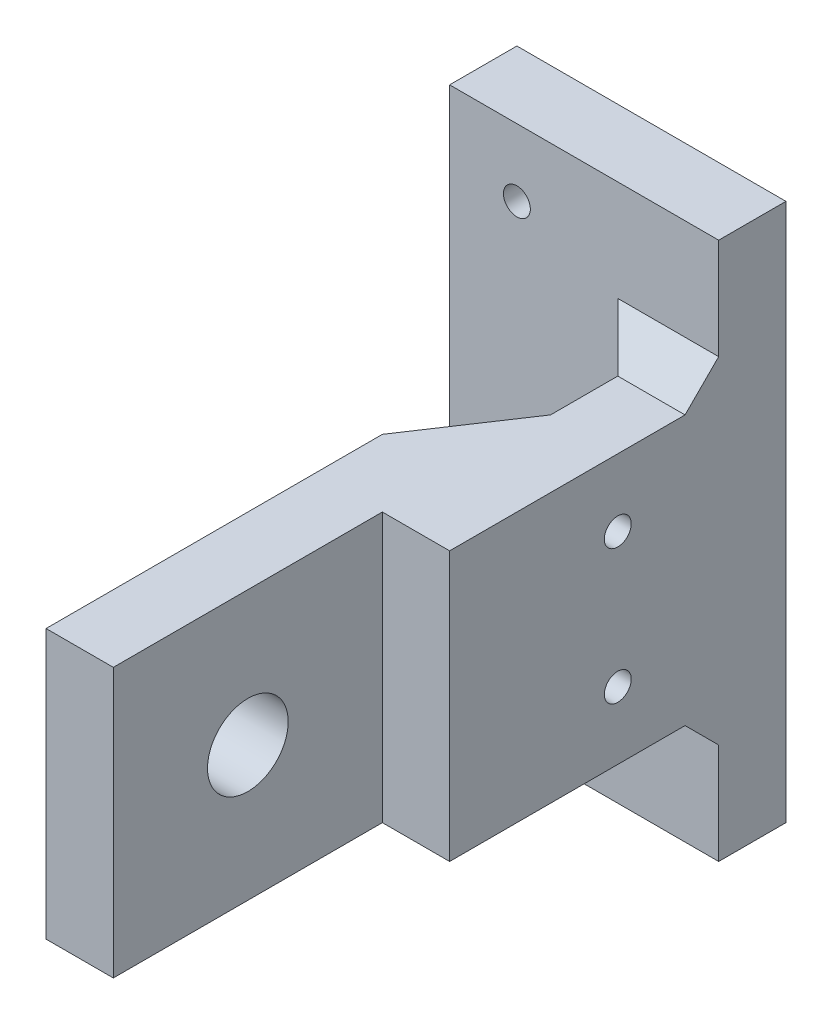
ISO-10303-21;
HEADER;
FILE_DESCRIPTION(('STEP AP214'),'2;1');
FILE_NAME('part.step','',(''),(''),'','','');
FILE_SCHEMA(('AUTOMOTIVE_DESIGN { 1 0 10303 214 1 1 1 1 }'));
ENDSEC;
DATA;
#1=APPLICATION_CONTEXT('core data for automotive mechanical design processes');
#2=APPLICATION_PROTOCOL_DEFINITION('international standard','automotive_design',2000,#1);
#3=PRODUCT_CONTEXT('',#1,'mechanical');
#4=PRODUCT('Part','Part','',(#3));
#5=PRODUCT_RELATED_PRODUCT_CATEGORY('part','',(#4));
#6=PRODUCT_DEFINITION_FORMATION('','',#4);
#7=PRODUCT_DEFINITION_CONTEXT('part definition',#1,'design');
#8=PRODUCT_DEFINITION('design','',#6,#7);
#9=PRODUCT_DEFINITION_SHAPE('','',#8);
#10=(LENGTH_UNIT() NAMED_UNIT(*) SI_UNIT(.MILLI.,.METRE.));
#11=(NAMED_UNIT(*) PLANE_ANGLE_UNIT() SI_UNIT($,.RADIAN.));
#12=(NAMED_UNIT(*) SI_UNIT($,.STERADIAN.) SOLID_ANGLE_UNIT());
#13=UNCERTAINTY_MEASURE_WITH_UNIT(LENGTH_MEASURE(1.E-05),#10,'distance_accuracy_value','');
#14=(GEOMETRIC_REPRESENTATION_CONTEXT(3) GLOBAL_UNCERTAINTY_ASSIGNED_CONTEXT((#13)) GLOBAL_UNIT_ASSIGNED_CONTEXT((#10,
#11,#12)) REPRESENTATION_CONTEXT('',''));
#15=CARTESIAN_POINT('',(0.,0.,0.));
#16=DIRECTION('',(0.,0.,1.));
#17=DIRECTION('',(1.,0.,0.));
#18=AXIS2_PLACEMENT_3D('',#15,#16,#17);
#19=CARTESIAN_POINT('',(-10.,40.001,40.));
#20=DIRECTION('',(1.,0.,0.));
#21=DIRECTION('',(0.,0.,-1.));
#22=AXIS2_PLACEMENT_3D('',#19,#20,#21);
#23=PLANE('',#22);
#24=CARTESIAN_POINT('',(-10.,-10.,25.));
#25=DIRECTION('',(-1.,0.,0.));
#26=DIRECTION('',(0.,0.,1.));
#27=AXIS2_PLACEMENT_3D('',#24,#25,#26);
#28=CIRCLE('',#27,2.);
#29=CARTESIAN_POINT('',(-10.,-10.,27.));
#30=VERTEX_POINT('',#29);
#31=EDGE_CURVE('E592',#30,#30,#28,.T.);
#32=ORIENTED_EDGE('',*,*,#31,.F.);
#33=EDGE_LOOP('',(#32));
#34=FACE_BOUND('',#33,.T.);
#35=CARTESIAN_POINT('',(-10.,10.,25.));
#36=DIRECTION('',(-1.,0.,0.));
#37=DIRECTION('',(0.,0.,1.));
#38=AXIS2_PLACEMENT_3D('',#35,#36,#37);
#39=CIRCLE('',#38,2.);
#40=CARTESIAN_POINT('',(-10.,10.,27.));
#41=VERTEX_POINT('',#40);
#42=EDGE_CURVE('E213',#41,#41,#39,.T.);
#43=ORIENTED_EDGE('',*,*,#42,.F.);
#44=EDGE_LOOP('',(#43));
#45=FACE_BOUND('',#44,.T.);
#46=DIRECTION('',(0.,0.,-1.));
#47=VECTOR('',#46,1.);
#48=CARTESIAN_POINT('',(-10.,20.,40.));
#49=LINE('',#48,#47);
#50=CARTESIAN_POINT('',(-10.,20.,25.));
#51=VERTEX_POINT('',#50);
#52=CARTESIAN_POINT('',(-10.,20.,15.));
#53=VERTEX_POINT('',#52);
#54=EDGE_CURVE('E180',#51,#53,#49,.T.);
#55=ORIENTED_EDGE('',*,*,#54,.T.);
#56=DIRECTION('',(0.,-1.,0.));
#57=VECTOR('',#56,1.);
#58=CARTESIAN_POINT('',(-10.,40.001,15.));
#59=LINE('',#58,#57);
#60=CARTESIAN_POINT('',(-10.,-20.,15.));
#61=VERTEX_POINT('',#60);
#62=EDGE_CURVE('E83',#53,#61,#59,.T.);
#63=ORIENTED_EDGE('',*,*,#62,.T.);
#64=DIRECTION('',(0.,0.,1.));
#65=VECTOR('',#64,1.);
#66=CARTESIAN_POINT('',(-10.,-20.,40.));
#67=LINE('',#66,#65);
#68=CARTESIAN_POINT('',(-10.,-20.,25.));
#69=VERTEX_POINT('',#68);
#70=EDGE_CURVE('E190',#61,#69,#67,.T.);
#71=ORIENTED_EDGE('',*,*,#70,.T.);
#72=DIRECTION('',(0.,-1.,0.));
#73=VECTOR('',#72,1.);
#74=CARTESIAN_POINT('',(-10.,-17.,25.));
#75=LINE('',#74,#73);
#76=CARTESIAN_POINT('',(-10.,-17.,25.));
#77=VERTEX_POINT('',#76);
#78=EDGE_CURVE('E191',#77,#69,#75,.T.);
#79=ORIENTED_EDGE('',*,*,#78,.F.);
#80=DIRECTION('',(0.,0.,1.));
#81=VECTOR('',#80,1.);
#82=CARTESIAN_POINT('',(-10.,-17.,25.));
#83=LINE('',#82,#81);
#84=CARTESIAN_POINT('',(-10.,-17.,40.));
#85=VERTEX_POINT('',#84);
#86=EDGE_CURVE('E224',#77,#85,#83,.T.);
#87=ORIENTED_EDGE('',*,*,#86,.T.);
#88=DIRECTION('',(0.,-1.,0.));
#89=VECTOR('',#88,1.);
#90=CARTESIAN_POINT('',(-10.,40.001,40.));
#91=LINE('',#90,#89);
#92=CARTESIAN_POINT('',(-10.,17.,40.));
#93=VERTEX_POINT('',#92);
#94=EDGE_CURVE('E234',#93,#85,#91,.T.);
#95=ORIENTED_EDGE('',*,*,#94,.F.);
#96=DIRECTION('',(0.,0.,1.));
#97=VECTOR('',#96,1.);
#98=CARTESIAN_POINT('',(-10.,17.,25.));
#99=LINE('',#98,#97);
#100=CARTESIAN_POINT('',(-10.,17.,25.));
#101=VERTEX_POINT('',#100);
#102=EDGE_CURVE('E197',#101,#93,#99,.T.);
#103=ORIENTED_EDGE('',*,*,#102,.F.);
#104=DIRECTION('',(0.,1.,0.));
#105=VECTOR('',#104,1.);
#106=CARTESIAN_POINT('',(-10.,17.,25.));
#107=LINE('',#106,#105);
#108=EDGE_CURVE('E194',#101,#51,#107,.T.);
#109=ORIENTED_EDGE('',*,*,#108,.T.);
#110=EDGE_LOOP('',(#55,#63,#71,#79,#87,#95,#103,#109));
#111=FACE_BOUND('',#110,.T.);
#112=ADVANCED_FACE('F57',(#34,#45,#111),#23,.F.);
#113=CARTESIAN_POINT('',(-40.,40.,10.));
#114=DIRECTION('',(0.,-1.,0.));
#115=DIRECTION('',(0.,0.,-1.));
#116=AXIS2_PLACEMENT_3D('',#113,#114,#115);
#117=PLANE('',#116);
#118=DIRECTION('',(0.,0.,1.));
#119=VECTOR('',#118,1.);
#120=CARTESIAN_POINT('',(0.,40.,50.));
#121=LINE('',#120,#119);
#122=CARTESIAN_POINT('',(0.,40.,0.));
#123=VERTEX_POINT('',#122);
#124=CARTESIAN_POINT('',(0.,40.,9.99999999999999));
#125=VERTEX_POINT('',#124);
#126=EDGE_CURVE('E261',#123,#125,#121,.T.);
#127=ORIENTED_EDGE('',*,*,#126,.F.);
#128=DIRECTION('',(-1.,0.,0.));
#129=VECTOR('',#128,1.);
#130=CARTESIAN_POINT('',(-40.,40.,0.));
#131=LINE('',#130,#129);
#132=CARTESIAN_POINT('',(-40.,40.,0.));
#133=VERTEX_POINT('',#132);
#134=EDGE_CURVE('E289',#123,#133,#131,.T.);
#135=ORIENTED_EDGE('',*,*,#134,.T.);
#136=DIRECTION('',(0.,0.,-1.));
#137=VECTOR('',#136,1.);
#138=CARTESIAN_POINT('',(-40.,40.,10.));
#139=LINE('',#138,#137);
#140=CARTESIAN_POINT('',(-40.,40.,10.));
#141=VERTEX_POINT('',#140);
#142=EDGE_CURVE('E306',#141,#133,#139,.T.);
#143=ORIENTED_EDGE('',*,*,#142,.F.);
#144=DIRECTION('',(-1.,0.,0.));
#145=VECTOR('',#144,1.);
#146=CARTESIAN_POINT('',(-40.,40.,10.));
#147=LINE('',#146,#145);
#148=EDGE_CURVE('E290',#125,#141,#147,.T.);
#149=ORIENTED_EDGE('',*,*,#148,.F.);
#150=EDGE_LOOP('',(#127,#135,#143,#149));
#151=FACE_BOUND('',#150,.T.);
#152=ADVANCED_FACE('F403',(#151),#117,.F.);
#153=CARTESIAN_POINT('',(-40.,-40.,10.));
#154=DIRECTION('',(0.,1.,0.));
#155=DIRECTION('',(0.,0.,1.));
#156=AXIS2_PLACEMENT_3D('',#153,#154,#155);
#157=PLANE('',#156);
#158=DIRECTION('',(0.,0.,1.));
#159=VECTOR('',#158,1.);
#160=CARTESIAN_POINT('',(0.,-40.,50.));
#161=LINE('',#160,#159);
#162=CARTESIAN_POINT('',(0.,-40.,0.));
#163=VERTEX_POINT('',#162);
#164=CARTESIAN_POINT('',(0.,-40.,9.99999999999999));
#165=VERTEX_POINT('',#164);
#166=EDGE_CURVE('E266',#163,#165,#161,.T.);
#167=ORIENTED_EDGE('',*,*,#166,.T.);
#168=DIRECTION('',(1.,0.,0.));
#169=VECTOR('',#168,1.);
#170=CARTESIAN_POINT('',(-40.,-40.,10.));
#171=LINE('',#170,#169);
#172=CARTESIAN_POINT('',(-40.,-40.,10.));
#173=VERTEX_POINT('',#172);
#174=EDGE_CURVE('E295',#173,#165,#171,.T.);
#175=ORIENTED_EDGE('',*,*,#174,.F.);
#176=DIRECTION('',(0.,0.,-1.));
#177=VECTOR('',#176,1.);
#178=CARTESIAN_POINT('',(-40.,-40.,10.));
#179=LINE('',#178,#177);
#180=CARTESIAN_POINT('',(-40.,-40.,0.));
#181=VERTEX_POINT('',#180);
#182=EDGE_CURVE('E298',#173,#181,#179,.T.);
#183=ORIENTED_EDGE('',*,*,#182,.T.);
#184=DIRECTION('',(1.,0.,0.));
#185=VECTOR('',#184,1.);
#186=CARTESIAN_POINT('',(-40.,-40.,0.));
#187=LINE('',#186,#185);
#188=EDGE_CURVE('E293',#181,#163,#187,.T.);
#189=ORIENTED_EDGE('',*,*,#188,.T.);
#190=EDGE_LOOP('',(#167,#175,#183,#189));
#191=FACE_BOUND('',#190,.T.);
#192=ADVANCED_FACE('F393',(#191),#157,.F.);
#193=CARTESIAN_POINT('',(0.,0.,10.));
#194=DIRECTION('',(0.,0.,1.));
#195=DIRECTION('',(1.,0.,0.));
#196=AXIS2_PLACEMENT_3D('',#193,#194,#195);
#197=PLANE('',#196);
#198=CARTESIAN_POINT('',(-30.,30.,10.));
#199=DIRECTION('',(0.,0.,1.));
#200=DIRECTION('',(1.,0.,0.));
#201=AXIS2_PLACEMENT_3D('',#198,#199,#200);
#202=CIRCLE('',#201,2.);
#203=CARTESIAN_POINT('',(-28.,30.,10.));
#204=VERTEX_POINT('',#203);
#205=EDGE_CURVE('E326',#204,#204,#202,.T.);
#206=ORIENTED_EDGE('',*,*,#205,.F.);
#207=EDGE_LOOP('',(#206));
#208=FACE_BOUND('',#207,.T.);
#209=DIRECTION('',(0.,1.,0.));
#210=VECTOR('',#209,1.);
#211=CARTESIAN_POINT('',(-15.,0.,10.));
#212=LINE('',#211,#210);
#213=CARTESIAN_POINT('',(-15.,-25.,10.));
#214=VERTEX_POINT('',#213);
#215=CARTESIAN_POINT('',(-15.,25.,10.));
#216=VERTEX_POINT('',#215);
#217=EDGE_CURVE('E310',#214,#216,#212,.T.);
#218=ORIENTED_EDGE('',*,*,#217,.T.);
#219=DIRECTION('',(1.,0.,0.));
#220=VECTOR('',#219,1.);
#221=CARTESIAN_POINT('',(0.,25.,10.));
#222=LINE('',#221,#220);
#223=CARTESIAN_POINT('',(0.,25.,9.99999999999999));
#224=VERTEX_POINT('',#223);
#225=EDGE_CURVE('E314',#216,#224,#222,.T.);
#226=ORIENTED_EDGE('',*,*,#225,.T.);
#227=DIRECTION('',(0.,1.,0.));
#228=VECTOR('',#227,1.);
#229=CARTESIAN_POINT('',(0.,40.001,9.99999999999999));
#230=LINE('',#229,#228);
#231=EDGE_CURVE('E236',#224,#125,#230,.T.);
#232=ORIENTED_EDGE('',*,*,#231,.T.);
#233=ORIENTED_EDGE('',*,*,#148,.T.);
#234=DIRECTION('',(0.,-1.,0.));
#235=VECTOR('',#234,1.);
#236=CARTESIAN_POINT('',(-40.,-40.,10.));
#237=LINE('',#236,#235);
#238=EDGE_CURVE('E292',#141,#173,#237,.T.);
#239=ORIENTED_EDGE('',*,*,#238,.T.);
#240=ORIENTED_EDGE('',*,*,#174,.T.);
#241=DIRECTION('',(0.,-1.,0.));
#242=VECTOR('',#241,1.);
#243=CARTESIAN_POINT('',(0.,-40.001,9.99999999999999));
#244=LINE('',#243,#242);
#245=CARTESIAN_POINT('',(0.,-25.,9.99999999999999));
#246=VERTEX_POINT('',#245);
#247=EDGE_CURVE('E264',#246,#165,#244,.T.);
#248=ORIENTED_EDGE('',*,*,#247,.F.);
#249=DIRECTION('',(-1.,0.,0.));
#250=VECTOR('',#249,1.);
#251=CARTESIAN_POINT('',(0.,-25.,10.));
#252=LINE('',#251,#250);
#253=EDGE_CURVE('E312',#246,#214,#252,.T.);
#254=ORIENTED_EDGE('',*,*,#253,.T.);
#255=EDGE_LOOP('',(#218,#226,#232,#233,#239,#240,#248,#254));
#256=FACE_BOUND('',#255,.T.);
#257=CARTESIAN_POINT('',(-30.,-30.,10.));
#258=DIRECTION('',(0.,0.,1.));
#259=DIRECTION('',(1.,0.,0.));
#260=AXIS2_PLACEMENT_3D('',#257,#258,#259);
#261=CIRCLE('',#260,2.);
#262=CARTESIAN_POINT('',(-28.,-30.,10.));
#263=VERTEX_POINT('',#262);
#264=EDGE_CURVE('E271',#263,#263,#261,.T.);
#265=ORIENTED_EDGE('',*,*,#264,.F.);
#266=EDGE_LOOP('',(#265));
#267=FACE_BOUND('',#266,.T.);
#268=ADVANCED_FACE('F387',(#208,#256,#267),#197,.T.);
#269=CARTESIAN_POINT('',(0.,0.,0.));
#270=DIRECTION('',(0.,0.,1.));
#271=DIRECTION('',(1.,0.,0.));
#272=AXIS2_PLACEMENT_3D('',#269,#270,#271);
#273=PLANE('',#272);
#274=CARTESIAN_POINT('',(-30.,30.,0.));
#275=DIRECTION('',(0.,0.,1.));
#276=DIRECTION('',(1.,0.,0.));
#277=AXIS2_PLACEMENT_3D('',#274,#275,#276);
#278=CIRCLE('',#277,2.);
#279=CARTESIAN_POINT('',(-28.,30.,0.));
#280=VERTEX_POINT('',#279);
#281=EDGE_CURVE('E319',#280,#280,#278,.T.);
#282=ORIENTED_EDGE('',*,*,#281,.T.);
#283=EDGE_LOOP('',(#282));
#284=FACE_BOUND('',#283,.T.);
#285=CARTESIAN_POINT('',(-30.,-30.,0.));
#286=DIRECTION('',(0.,0.,1.));
#287=DIRECTION('',(1.,0.,0.));
#288=AXIS2_PLACEMENT_3D('',#285,#286,#287);
#289=CIRCLE('',#288,2.);
#290=CARTESIAN_POINT('',(-28.,-30.,0.));
#291=VERTEX_POINT('',#290);
#292=EDGE_CURVE('E274',#291,#291,#289,.T.);
#293=ORIENTED_EDGE('',*,*,#292,.T.);
#294=EDGE_LOOP('',(#293));
#295=FACE_BOUND('',#294,.T.);
#296=DIRECTION('',(0.,1.,0.));
#297=VECTOR('',#296,1.);
#298=CARTESIAN_POINT('',(0.,-40.001,0.));
#299=LINE('',#298,#297);
#300=EDGE_CURVE('E269',#163,#123,#299,.T.);
#301=ORIENTED_EDGE('',*,*,#300,.F.);
#302=ORIENTED_EDGE('',*,*,#188,.F.);
#303=DIRECTION('',(0.,-1.,0.));
#304=VECTOR('',#303,1.);
#305=CARTESIAN_POINT('',(-40.,-40.,0.));
#306=LINE('',#305,#304);
#307=EDGE_CURVE('E300',#133,#181,#306,.T.);
#308=ORIENTED_EDGE('',*,*,#307,.F.);
#309=ORIENTED_EDGE('',*,*,#134,.F.);
#310=EDGE_LOOP('',(#301,#302,#308,#309));
#311=FACE_BOUND('',#310,.T.);
#312=ADVANCED_FACE('F399',(#284,#295,#311),#273,.F.);
#313=CARTESIAN_POINT('',(-20.,20.,90.));
#314=DIRECTION('',(0.,-1.,0.));
#315=DIRECTION('',(0.,0.,-1.));
#316=AXIS2_PLACEMENT_3D('',#313,#314,#315);
#317=PLANE('',#316);
#318=DIRECTION('',(0.,0.,1.));
#319=VECTOR('',#318,1.);
#320=CARTESIAN_POINT('',(0.,20.,50.));
#321=LINE('',#320,#319);
#322=CARTESIAN_POINT('',(0.,20.,15.));
#323=VERTEX_POINT('',#322);
#324=CARTESIAN_POINT('',(0.,20.,50.));
#325=VERTEX_POINT('',#324);
#326=EDGE_CURVE('E240',#323,#325,#321,.T.);
#327=ORIENTED_EDGE('',*,*,#326,.F.);
#328=DIRECTION('',(-1.,0.,0.));
#329=VECTOR('',#328,1.);
#330=CARTESIAN_POINT('',(-20.,20.,15.));
#331=LINE('',#330,#329);
#332=EDGE_CURVE('E189',#323,#53,#331,.T.);
#333=ORIENTED_EDGE('',*,*,#332,.T.);
#334=ORIENTED_EDGE('',*,*,#54,.F.);
#335=DIRECTION('',(0.554700196225229,0.,-0.832050294337844));
#336=VECTOR('',#335,1.);
#337=CARTESIAN_POINT('',(-20.,20.,40.));
#338=LINE('',#337,#336);
#339=CARTESIAN_POINT('',(-20.,20.,40.));
#340=VERTEX_POINT('',#339);
#341=EDGE_CURVE('E186',#340,#51,#338,.T.);
#342=ORIENTED_EDGE('',*,*,#341,.F.);
#343=DIRECTION('',(0.,0.,-1.));
#344=VECTOR('',#343,1.);
#345=CARTESIAN_POINT('',(-20.,20.,90.));
#346=LINE('',#345,#344);
#347=CARTESIAN_POINT('',(-20.,20.,90.));
#348=VERTEX_POINT('',#347);
#349=EDGE_CURVE('E287',#348,#340,#346,.T.);
#350=ORIENTED_EDGE('',*,*,#349,.F.);
#351=DIRECTION('',(-1.,0.,0.));
#352=VECTOR('',#351,1.);
#353=CARTESIAN_POINT('',(-20.,20.,90.));
#354=LINE('',#353,#352);
#355=CARTESIAN_POINT('',(-10.,20.,90.));
#356=VERTEX_POINT('',#355);
#357=EDGE_CURVE('E277',#356,#348,#354,.T.);
#358=ORIENTED_EDGE('',*,*,#357,.F.);
#359=DIRECTION('',(0.,0.,1.));
#360=VECTOR('',#359,1.);
#361=CARTESIAN_POINT('',(-10.,20.,90.));
#362=LINE('',#361,#360);
#363=CARTESIAN_POINT('',(-9.99999999999999,20.,50.));
#364=VERTEX_POINT('',#363);
#365=EDGE_CURVE('E242',#364,#356,#362,.T.);
#366=ORIENTED_EDGE('',*,*,#365,.F.);
#367=DIRECTION('',(-1.,0.,0.));
#368=VECTOR('',#367,1.);
#369=CARTESIAN_POINT('',(-9.99999999999999,20.,50.));
#370=LINE('',#369,#368);
#371=EDGE_CURVE('E255',#325,#364,#370,.T.);
#372=ORIENTED_EDGE('',*,*,#371,.F.);
#373=EDGE_LOOP('',(#327,#333,#334,#342,#350,#358,#366,#372));
#374=FACE_BOUND('',#373,.T.);
#375=ADVANCED_FACE('F183',(#374),#317,.F.);
#376=CARTESIAN_POINT('',(-20.,-20.,90.));
#377=DIRECTION('',(0.,1.,0.));
#378=DIRECTION('',(0.,0.,1.));
#379=AXIS2_PLACEMENT_3D('',#376,#377,#378);
#380=PLANE('',#379);
#381=ORIENTED_EDGE('',*,*,#70,.F.);
#382=DIRECTION('',(1.,0.,0.));
#383=VECTOR('',#382,1.);
#384=CARTESIAN_POINT('',(-20.,-20.,15.));
#385=LINE('',#384,#383);
#386=CARTESIAN_POINT('',(0.,-20.,15.));
#387=VERTEX_POINT('',#386);
#388=EDGE_CURVE('E75',#61,#387,#385,.T.);
#389=ORIENTED_EDGE('',*,*,#388,.T.);
#390=DIRECTION('',(0.,0.,-1.));
#391=VECTOR('',#390,1.);
#392=CARTESIAN_POINT('',(0.,-20.,50.));
#393=LINE('',#392,#391);
#394=CARTESIAN_POINT('',(0.,-20.,50.));
#395=VERTEX_POINT('',#394);
#396=EDGE_CURVE('E250',#395,#387,#393,.T.);
#397=ORIENTED_EDGE('',*,*,#396,.F.);
#398=DIRECTION('',(1.,0.,0.));
#399=VECTOR('',#398,1.);
#400=CARTESIAN_POINT('',(-9.99999999999999,-20.,50.));
#401=LINE('',#400,#399);
#402=CARTESIAN_POINT('',(-9.99999999999999,-20.,50.));
#403=VERTEX_POINT('',#402);
#404=EDGE_CURVE('E247',#403,#395,#401,.T.);
#405=ORIENTED_EDGE('',*,*,#404,.F.);
#406=DIRECTION('',(0.,0.,-1.));
#407=VECTOR('',#406,1.);
#408=CARTESIAN_POINT('',(-10.,-20.,90.));
#409=LINE('',#408,#407);
#410=CARTESIAN_POINT('',(-10.,-20.,90.));
#411=VERTEX_POINT('',#410);
#412=EDGE_CURVE('E244',#411,#403,#409,.T.);
#413=ORIENTED_EDGE('',*,*,#412,.F.);
#414=DIRECTION('',(1.,0.,0.));
#415=VECTOR('',#414,1.);
#416=CARTESIAN_POINT('',(-20.,-20.,90.));
#417=LINE('',#416,#415);
#418=CARTESIAN_POINT('',(-20.,-20.,90.));
#419=VERTEX_POINT('',#418);
#420=EDGE_CURVE('E281',#419,#411,#417,.T.);
#421=ORIENTED_EDGE('',*,*,#420,.F.);
#422=DIRECTION('',(0.,0.,-1.));
#423=VECTOR('',#422,1.);
#424=CARTESIAN_POINT('',(-20.,-20.,90.));
#425=LINE('',#424,#423);
#426=CARTESIAN_POINT('',(-20.,-20.,40.));
#427=VERTEX_POINT('',#426);
#428=EDGE_CURVE('E284',#419,#427,#425,.T.);
#429=ORIENTED_EDGE('',*,*,#428,.T.);
#430=DIRECTION('',(0.554700196225229,0.,-0.832050294337844));
#431=VECTOR('',#430,1.);
#432=CARTESIAN_POINT('',(-20.,-20.,40.));
#433=LINE('',#432,#431);
#434=EDGE_CURVE('E201',#427,#69,#433,.T.);
#435=ORIENTED_EDGE('',*,*,#434,.T.);
#436=EDGE_LOOP('',(#381,#389,#397,#405,#413,#421,#429,#435));
#437=FACE_BOUND('',#436,.T.);
#438=ADVANCED_FACE('F359',(#437),#380,.F.);
#439=CARTESIAN_POINT('',(-40.,-40.,10.));
#440=DIRECTION('',(1.,0.,0.));
#441=DIRECTION('',(0.,0.,-1.));
#442=AXIS2_PLACEMENT_3D('',#439,#440,#441);
#443=PLANE('',#442);
#444=ORIENTED_EDGE('',*,*,#307,.T.);
#445=ORIENTED_EDGE('',*,*,#182,.F.);
#446=ORIENTED_EDGE('',*,*,#238,.F.);
#447=ORIENTED_EDGE('',*,*,#142,.T.);
#448=EDGE_LOOP('',(#444,#445,#446,#447));
#449=FACE_BOUND('',#448,.T.);
#450=ADVANCED_FACE('F406',(#449),#443,.F.);
#451=CARTESIAN_POINT('',(-20.,20.,90.));
#452=DIRECTION('',(1.,0.,0.));
#453=DIRECTION('',(0.,0.,-1.));
#454=AXIS2_PLACEMENT_3D('',#451,#452,#453);
#455=PLANE('',#454);
#456=CARTESIAN_POINT('',(-20.,0.,70.));
#457=DIRECTION('',(-1.,0.,0.));
#458=DIRECTION('',(0.,0.,1.));
#459=AXIS2_PLACEMENT_3D('',#456,#457,#458);
#460=CIRCLE('',#459,6.);
#461=CARTESIAN_POINT('',(-20.,0.,76.));
#462=VERTEX_POINT('',#461);
#463=EDGE_CURVE('E324',#462,#462,#460,.T.);
#464=ORIENTED_EDGE('',*,*,#463,.F.);
#465=EDGE_LOOP('',(#464));
#466=FACE_BOUND('',#465,.T.);
#467=ORIENTED_EDGE('',*,*,#349,.T.);
#468=DIRECTION('',(0.,-1.,0.));
#469=VECTOR('',#468,1.);
#470=CARTESIAN_POINT('',(-20.,40.001,40.));
#471=LINE('',#470,#469);
#472=CARTESIAN_POINT('',(-20.,17.,40.));
#473=VERTEX_POINT('',#472);
#474=EDGE_CURVE('E206',#340,#473,#471,.T.);
#475=ORIENTED_EDGE('',*,*,#474,.T.);
#476=CARTESIAN_POINT('',(-20.,-17.,40.));
#477=VERTEX_POINT('',#476);
#478=EDGE_CURVE('E237',#473,#477,#471,.T.);
#479=ORIENTED_EDGE('',*,*,#478,.T.);
#480=DIRECTION('',(0.,-1.,0.));
#481=VECTOR('',#480,1.);
#482=CARTESIAN_POINT('',(-20.,-17.,40.));
#483=LINE('',#482,#481);
#484=EDGE_CURVE('E227',#477,#427,#483,.T.);
#485=ORIENTED_EDGE('',*,*,#484,.T.);
#486=ORIENTED_EDGE('',*,*,#428,.F.);
#487=DIRECTION('',(0.,-1.,0.));
#488=VECTOR('',#487,1.);
#489=CARTESIAN_POINT('',(-20.,20.,90.));
#490=LINE('',#489,#488);
#491=EDGE_CURVE('E279',#348,#419,#490,.T.);
#492=ORIENTED_EDGE('',*,*,#491,.F.);
#493=EDGE_LOOP('',(#467,#475,#479,#485,#486,#492));
#494=FACE_BOUND('',#493,.T.);
#495=ADVANCED_FACE('F356',(#466,#494),#455,.F.);
#496=CARTESIAN_POINT('',(0.,0.,90.));
#497=DIRECTION('',(0.,0.,1.));
#498=DIRECTION('',(1.,0.,0.));
#499=AXIS2_PLACEMENT_3D('',#496,#497,#498);
#500=PLANE('',#499);
#501=DIRECTION('',(0.,-1.,0.));
#502=VECTOR('',#501,1.);
#503=CARTESIAN_POINT('',(-10.,40.001,90.));
#504=LINE('',#503,#502);
#505=EDGE_CURVE('E253',#356,#411,#504,.T.);
#506=ORIENTED_EDGE('',*,*,#505,.F.);
#507=ORIENTED_EDGE('',*,*,#357,.T.);
#508=ORIENTED_EDGE('',*,*,#491,.T.);
#509=ORIENTED_EDGE('',*,*,#420,.T.);
#510=EDGE_LOOP('',(#506,#507,#508,#509));
#511=FACE_BOUND('',#510,.T.);
#512=ADVANCED_FACE('F364',(#511),#500,.T.);
#513=CARTESIAN_POINT('',(-30.,-30.,10.));
#514=DIRECTION('',(0.,0.,1.));
#515=DIRECTION('',(1.,0.,0.));
#516=AXIS2_PLACEMENT_3D('',#513,#514,#515);
#517=CYLINDRICAL_SURFACE('',#516,2.);
#518=ORIENTED_EDGE('',*,*,#292,.F.);
#519=EDGE_LOOP('',(#518));
#520=FACE_BOUND('',#519,.T.);
#521=ORIENTED_EDGE('',*,*,#264,.T.);
#522=EDGE_LOOP('',(#521));
#523=FACE_BOUND('',#522,.T.);
#524=ADVANCED_FACE('F439',(#520,#523),#517,.F.);
#525=CARTESIAN_POINT('',(0.,-40.001,50.));
#526=DIRECTION('',(1.,0.,0.));
#527=DIRECTION('',(0.,0.,-1.));
#528=AXIS2_PLACEMENT_3D('',#525,#526,#527);
#529=PLANE('',#528);
#530=CARTESIAN_POINT('',(0.,-10.,25.));
#531=DIRECTION('',(1.,0.,0.));
#532=DIRECTION('',(0.,0.,-1.));
#533=AXIS2_PLACEMENT_3D('',#530,#531,#532);
#534=CIRCLE('',#533,2.);
#535=CARTESIAN_POINT('',(0.,-10.,23.));
#536=VERTEX_POINT('',#535);
#537=EDGE_CURVE('E331',#536,#536,#534,.T.);
#538=ORIENTED_EDGE('',*,*,#537,.F.);
#539=EDGE_LOOP('',(#538));
#540=FACE_BOUND('',#539,.T.);
#541=CARTESIAN_POINT('',(0.,10.,25.));
#542=DIRECTION('',(1.,0.,0.));
#543=DIRECTION('',(0.,0.,-1.));
#544=AXIS2_PLACEMENT_3D('',#541,#542,#543);
#545=CIRCLE('',#544,2.);
#546=CARTESIAN_POINT('',(0.,10.,23.));
#547=VERTEX_POINT('',#546);
#548=EDGE_CURVE('E208',#547,#547,#545,.T.);
#549=ORIENTED_EDGE('',*,*,#548,.F.);
#550=EDGE_LOOP('',(#549));
#551=FACE_BOUND('',#550,.T.);
#552=ORIENTED_EDGE('',*,*,#300,.T.);
#553=ORIENTED_EDGE('',*,*,#126,.T.);
#554=ORIENTED_EDGE('',*,*,#231,.F.);
#555=DIRECTION('',(0.,-0.707106781186545,0.70710678118655));
#556=VECTOR('',#555,1.);
#557=CARTESIAN_POINT('',(0.,20.,15.));
#558=LINE('',#557,#556);
#559=EDGE_CURVE('E67',#224,#323,#558,.T.);
#560=ORIENTED_EDGE('',*,*,#559,.T.);
#561=ORIENTED_EDGE('',*,*,#326,.T.);
#562=DIRECTION('',(0.,-1.,0.));
#563=VECTOR('',#562,1.);
#564=CARTESIAN_POINT('',(0.,40.001,50.));
#565=LINE('',#564,#563);
#566=EDGE_CURVE('E256',#325,#395,#565,.T.);
#567=ORIENTED_EDGE('',*,*,#566,.T.);
#568=ORIENTED_EDGE('',*,*,#396,.T.);
#569=DIRECTION('',(0.,-0.707106781186545,-0.70710678118655));
#570=VECTOR('',#569,1.);
#571=CARTESIAN_POINT('',(0.,-20.,15.));
#572=LINE('',#571,#570);
#573=EDGE_CURVE('E13',#387,#246,#572,.T.);
#574=ORIENTED_EDGE('',*,*,#573,.T.);
#575=ORIENTED_EDGE('',*,*,#247,.T.);
#576=ORIENTED_EDGE('',*,*,#166,.F.);
#577=EDGE_LOOP('',(#552,#553,#554,#560,#561,#567,#568,#574,#575,#576));
#578=FACE_BOUND('',#577,.T.);
#579=ADVANCED_FACE('F374',(#540,#551,#578),#529,.T.);
#580=CARTESIAN_POINT('',(-10.,40.001,90.));
#581=DIRECTION('',(-1.,0.,0.));
#582=DIRECTION('',(0.,0.,1.));
#583=AXIS2_PLACEMENT_3D('',#580,#581,#582);
#584=PLANE('',#583);
#585=CARTESIAN_POINT('',(-10.,0.,70.));
#586=DIRECTION('',(-1.,0.,0.));
#587=DIRECTION('',(0.,0.,1.));
#588=AXIS2_PLACEMENT_3D('',#585,#586,#587);
#589=CIRCLE('',#588,6.);
#590=CARTESIAN_POINT('',(-10.,0.,76.));
#591=VERTEX_POINT('',#590);
#592=EDGE_CURVE('E337',#591,#591,#589,.T.);
#593=ORIENTED_EDGE('',*,*,#592,.T.);
#594=EDGE_LOOP('',(#593));
#595=FACE_BOUND('',#594,.T.);
#596=ORIENTED_EDGE('',*,*,#365,.T.);
#597=ORIENTED_EDGE('',*,*,#505,.T.);
#598=ORIENTED_EDGE('',*,*,#412,.T.);
#599=DIRECTION('',(0.,-1.,0.));
#600=VECTOR('',#599,1.);
#601=CARTESIAN_POINT('',(-9.99999999999999,40.001,50.));
#602=LINE('',#601,#600);
#603=EDGE_CURVE('E252',#364,#403,#602,.T.);
#604=ORIENTED_EDGE('',*,*,#603,.F.);
#605=EDGE_LOOP('',(#596,#597,#598,#604));
#606=FACE_BOUND('',#605,.T.);
#607=ADVANCED_FACE('F369',(#595,#606),#584,.F.);
#608=CARTESIAN_POINT('',(-9.99999999999999,40.001,50.));
#609=DIRECTION('',(0.,0.,-1.));
#610=DIRECTION('',(-1.,0.,0.));
#611=AXIS2_PLACEMENT_3D('',#608,#609,#610);
#612=PLANE('',#611);
#613=ORIENTED_EDGE('',*,*,#371,.T.);
#614=ORIENTED_EDGE('',*,*,#603,.T.);
#615=ORIENTED_EDGE('',*,*,#404,.T.);
#616=ORIENTED_EDGE('',*,*,#566,.F.);
#617=EDGE_LOOP('',(#613,#614,#615,#616));
#618=FACE_BOUND('',#617,.T.);
#619=ADVANCED_FACE('F372',(#618),#612,.F.);
#620=CARTESIAN_POINT('',(-20.,40.001,40.));
#621=DIRECTION('',(0.,0.,1.));
#622=DIRECTION('',(1.,0.,0.));
#623=AXIS2_PLACEMENT_3D('',#620,#621,#622);
#624=PLANE('',#623);
#625=ORIENTED_EDGE('',*,*,#478,.F.);
#626=DIRECTION('',(-1.,0.,0.));
#627=VECTOR('',#626,1.);
#628=CARTESIAN_POINT('',(-10.,17.,40.));
#629=LINE('',#628,#627);
#630=EDGE_CURVE('E207',#93,#473,#629,.T.);
#631=ORIENTED_EDGE('',*,*,#630,.F.);
#632=ORIENTED_EDGE('',*,*,#94,.T.);
#633=DIRECTION('',(-1.,0.,0.));
#634=VECTOR('',#633,1.);
#635=CARTESIAN_POINT('',(-10.,-17.,40.));
#636=LINE('',#635,#634);
#637=EDGE_CURVE('E218',#85,#477,#636,.T.);
#638=ORIENTED_EDGE('',*,*,#637,.T.);
#639=EDGE_LOOP('',(#625,#631,#632,#638));
#640=FACE_BOUND('',#639,.T.);
#641=ADVANCED_FACE('F344',(#640),#624,.F.);
#642=CARTESIAN_POINT('',(-20.,-17.,40.));
#643=DIRECTION('',(-0.832050294337843,0.,-0.554700196225229));
#644=DIRECTION('',(-0.554700196225229,0.,0.832050294337844));
#645=AXIS2_PLACEMENT_3D('',#642,#643,#644);
#646=PLANE('',#645);
#647=ORIENTED_EDGE('',*,*,#434,.F.);
#648=ORIENTED_EDGE('',*,*,#484,.F.);
#649=DIRECTION('',(0.554700196225229,0.,-0.832050294337844));
#650=VECTOR('',#649,1.);
#651=CARTESIAN_POINT('',(-20.,-17.,40.));
#652=LINE('',#651,#650);
#653=EDGE_CURVE('E221',#477,#77,#652,.T.);
#654=ORIENTED_EDGE('',*,*,#653,.T.);
#655=ORIENTED_EDGE('',*,*,#78,.T.);
#656=EDGE_LOOP('',(#647,#648,#654,#655));
#657=FACE_BOUND('',#656,.T.);
#658=ADVANCED_FACE('F353',(#657),#646,.T.);
#659=CARTESIAN_POINT('',(0.,-17.,0.));
#660=DIRECTION('',(0.,1.,0.));
#661=DIRECTION('',(0.,0.,1.));
#662=AXIS2_PLACEMENT_3D('',#659,#660,#661);
#663=PLANE('',#662);
#664=ORIENTED_EDGE('',*,*,#637,.F.);
#665=ORIENTED_EDGE('',*,*,#86,.F.);
#666=ORIENTED_EDGE('',*,*,#653,.F.);
#667=EDGE_LOOP('',(#664,#665,#666));
#668=FACE_BOUND('',#667,.T.);
#669=ADVANCED_FACE('F349',(#668),#663,.T.);
#670=CARTESIAN_POINT('',(-20.,17.,40.));
#671=DIRECTION('',(0.832050294337843,0.,0.554700196225229));
#672=DIRECTION('',(0.554700196225229,0.,-0.832050294337844));
#673=AXIS2_PLACEMENT_3D('',#670,#671,#672);
#674=PLANE('',#673);
#675=ORIENTED_EDGE('',*,*,#341,.T.);
#676=ORIENTED_EDGE('',*,*,#108,.F.);
#677=DIRECTION('',(0.554700196225229,0.,-0.832050294337844));
#678=VECTOR('',#677,1.);
#679=CARTESIAN_POINT('',(-20.,17.,40.));
#680=LINE('',#679,#678);
#681=EDGE_CURVE('E202',#473,#101,#680,.T.);
#682=ORIENTED_EDGE('',*,*,#681,.F.);
#683=ORIENTED_EDGE('',*,*,#474,.F.);
#684=EDGE_LOOP('',(#675,#676,#682,#683));
#685=FACE_BOUND('',#684,.T.);
#686=ADVANCED_FACE('F204',(#685),#674,.F.);
#687=CARTESIAN_POINT('',(0.,17.,0.));
#688=DIRECTION('',(0.,-1.,0.));
#689=DIRECTION('',(0.,0.,1.));
#690=AXIS2_PLACEMENT_3D('',#687,#688,#689);
#691=PLANE('',#690);
#692=ORIENTED_EDGE('',*,*,#630,.T.);
#693=ORIENTED_EDGE('',*,*,#681,.T.);
#694=ORIENTED_EDGE('',*,*,#102,.T.);
#695=EDGE_LOOP('',(#692,#693,#694));
#696=FACE_BOUND('',#695,.T.);
#697=ADVANCED_FACE('F342',(#696),#691,.T.);
#698=CARTESIAN_POINT('',(-10.,10.,25.));
#699=DIRECTION('',(-1.,0.,0.));
#700=DIRECTION('',(0.,0.,1.));
#701=AXIS2_PLACEMENT_3D('',#698,#699,#700);
#702=CYLINDRICAL_SURFACE('',#701,2.);
#703=ORIENTED_EDGE('',*,*,#548,.T.);
#704=EDGE_LOOP('',(#703));
#705=FACE_BOUND('',#704,.T.);
#706=ORIENTED_EDGE('',*,*,#42,.T.);
#707=EDGE_LOOP('',(#706));
#708=FACE_BOUND('',#707,.T.);
#709=ADVANCED_FACE('F505',(#705,#708),#702,.F.);
#710=CARTESIAN_POINT('',(-20.,0.,70.));
#711=DIRECTION('',(-1.,0.,0.));
#712=DIRECTION('',(0.,0.,1.));
#713=AXIS2_PLACEMENT_3D('',#710,#711,#712);
#714=CYLINDRICAL_SURFACE('',#713,6.);
#715=ORIENTED_EDGE('',*,*,#592,.F.);
#716=EDGE_LOOP('',(#715));
#717=FACE_BOUND('',#716,.T.);
#718=ORIENTED_EDGE('',*,*,#463,.T.);
#719=EDGE_LOOP('',(#718));
#720=FACE_BOUND('',#719,.T.);
#721=ADVANCED_FACE('F513',(#717,#720),#714,.F.);
#722=CARTESIAN_POINT('',(-20.,-20.,15.));
#723=DIRECTION('',(0.,0.70710678118655,-0.707106781186545));
#724=DIRECTION('',(1.,0.,0.));
#725=AXIS2_PLACEMENT_3D('',#722,#723,#724);
#726=PLANE('',#725);
#727=ORIENTED_EDGE('',*,*,#573,.F.);
#728=ORIENTED_EDGE('',*,*,#388,.F.);
#729=DIRECTION('',(0.577350269189624,0.577350269189624,0.577350269189629));
#730=VECTOR('',#729,1.);
#731=CARTESIAN_POINT('',(10.0003333333332,0.000333333333220331,35.0003333333334));
#732=LINE('',#731,#730);
#733=EDGE_CURVE('E62',#214,#61,#732,.T.);
#734=ORIENTED_EDGE('',*,*,#733,.F.);
#735=ORIENTED_EDGE('',*,*,#253,.F.);
#736=EDGE_LOOP('',(#727,#728,#734,#735));
#737=FACE_BOUND('',#736,.T.);
#738=ADVANCED_FACE('F60',(#737),#726,.F.);
#739=CARTESIAN_POINT('',(-10.,40.001,15.));
#740=DIRECTION('',(0.70710678118655,0.,-0.707106781186545));
#741=DIRECTION('',(0.,-1.,0.));
#742=AXIS2_PLACEMENT_3D('',#739,#740,#741);
#743=PLANE('',#742);
#744=ORIENTED_EDGE('',*,*,#733,.T.);
#745=ORIENTED_EDGE('',*,*,#62,.F.);
#746=DIRECTION('',(-0.577350269189624,0.577350269189624,-0.577350269189629));
#747=VECTOR('',#746,1.);
#748=CARTESIAN_POINT('',(-16.667,26.667,8.333));
#749=LINE('',#748,#747);
#750=EDGE_CURVE('E318',#216,#53,#749,.F.);
#751=ORIENTED_EDGE('',*,*,#750,.F.);
#752=ORIENTED_EDGE('',*,*,#217,.F.);
#753=EDGE_LOOP('',(#744,#745,#751,#752));
#754=FACE_BOUND('',#753,.T.);
#755=ADVANCED_FACE('F382',(#754),#743,.F.);
#756=CARTESIAN_POINT('',(-20.,20.,15.));
#757=DIRECTION('',(0.,-0.70710678118655,-0.707106781186545));
#758=DIRECTION('',(-1.,0.,0.));
#759=AXIS2_PLACEMENT_3D('',#756,#757,#758);
#760=PLANE('',#759);
#761=ORIENTED_EDGE('',*,*,#559,.F.);
#762=ORIENTED_EDGE('',*,*,#225,.F.);
#763=ORIENTED_EDGE('',*,*,#750,.T.);
#764=ORIENTED_EDGE('',*,*,#332,.F.);
#765=EDGE_LOOP('',(#761,#762,#763,#764));
#766=FACE_BOUND('',#765,.T.);
#767=ADVANCED_FACE('F378',(#766),#760,.F.);
#768=CARTESIAN_POINT('',(-30.,30.,10.));
#769=DIRECTION('',(0.,0.,1.));
#770=DIRECTION('',(1.,0.,0.));
#771=AXIS2_PLACEMENT_3D('',#768,#769,#770);
#772=CYLINDRICAL_SURFACE('',#771,2.);
#773=ORIENTED_EDGE('',*,*,#281,.F.);
#774=EDGE_LOOP('',(#773));
#775=FACE_BOUND('',#774,.T.);
#776=ORIENTED_EDGE('',*,*,#205,.T.);
#777=EDGE_LOOP('',(#776));
#778=FACE_BOUND('',#777,.T.);
#779=ADVANCED_FACE('F562',(#775,#778),#772,.F.);
#780=CARTESIAN_POINT('',(-10.,-10.,25.));
#781=DIRECTION('',(-1.,0.,0.));
#782=DIRECTION('',(0.,0.,1.));
#783=AXIS2_PLACEMENT_3D('',#780,#781,#782);
#784=CYLINDRICAL_SURFACE('',#783,2.);
#785=ORIENTED_EDGE('',*,*,#537,.T.);
#786=EDGE_LOOP('',(#785));
#787=FACE_BOUND('',#786,.T.);
#788=ORIENTED_EDGE('',*,*,#31,.T.);
#789=EDGE_LOOP('',(#788));
#790=FACE_BOUND('',#789,.T.);
#791=ADVANCED_FACE('F574',(#787,#790),#784,.F.);
#792=CLOSED_SHELL('',(#112,#152,#192,#268,#312,#375,#438,#450,#495,#512,#524,#579,#607,#619,
#641,#658,#669,#686,#697,#709,#721,#738,#755,#767,#779,#791));
#793=MANIFOLD_SOLID_BREP('B2',#792);
#794=ADVANCED_BREP_SHAPE_REPRESENTATION('',(#18,#793),#14);
#795=SHAPE_DEFINITION_REPRESENTATION(#9,#794);
ENDSEC;
END-ISO-10303-21;
